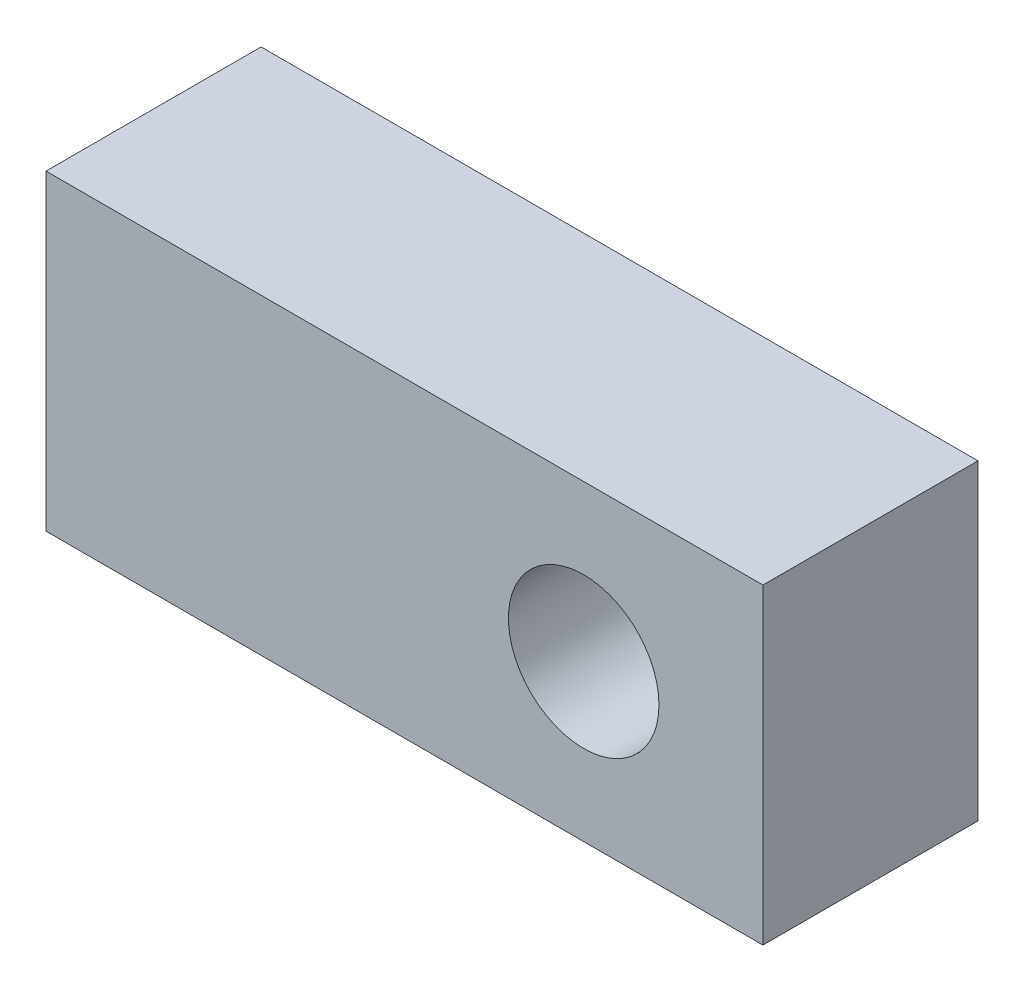
ISO-10303-21;
HEADER;
FILE_DESCRIPTION(('STEP AP214'),'2;1');
FILE_NAME('part.step','',(''),(''),'','','');
FILE_SCHEMA(('AUTOMOTIVE_DESIGN { 1 0 10303 214 1 1 1 1 }'));
ENDSEC;
DATA;
#1=APPLICATION_CONTEXT('core data for automotive mechanical design processes');
#2=APPLICATION_PROTOCOL_DEFINITION('international standard','automotive_design',2000,#1);
#3=PRODUCT_CONTEXT('',#1,'mechanical');
#4=PRODUCT('Part','Part','',(#3));
#5=PRODUCT_RELATED_PRODUCT_CATEGORY('part','',(#4));
#6=PRODUCT_DEFINITION_FORMATION('','',#4);
#7=PRODUCT_DEFINITION_CONTEXT('part definition',#1,'design');
#8=PRODUCT_DEFINITION('design','',#6,#7);
#9=PRODUCT_DEFINITION_SHAPE('','',#8);
#10=(LENGTH_UNIT() NAMED_UNIT(*) SI_UNIT(.MILLI.,.METRE.));
#11=(NAMED_UNIT(*) PLANE_ANGLE_UNIT() SI_UNIT($,.RADIAN.));
#12=(NAMED_UNIT(*) SI_UNIT($,.STERADIAN.) SOLID_ANGLE_UNIT());
#13=UNCERTAINTY_MEASURE_WITH_UNIT(LENGTH_MEASURE(1.E-05),#10,'distance_accuracy_value','');
#14=(GEOMETRIC_REPRESENTATION_CONTEXT(3) GLOBAL_UNCERTAINTY_ASSIGNED_CONTEXT((#13)) GLOBAL_UNIT_ASSIGNED_CONTEXT((#10,
#11,#12)) REPRESENTATION_CONTEXT('',''));
#15=CARTESIAN_POINT('',(0.,0.,0.));
#16=DIRECTION('',(0.,0.,1.));
#17=DIRECTION('',(1.,0.,0.));
#18=AXIS2_PLACEMENT_3D('',#15,#16,#17);
#19=CARTESIAN_POINT('',(0.,0.,3.));
#20=DIRECTION('',(0.,0.,-1.));
#21=DIRECTION('',(-1.,0.,0.));
#22=AXIS2_PLACEMENT_3D('',#19,#20,#21);
#23=PLANE('',#22);
#24=DIRECTION('',(0.,1.,0.));
#25=VECTOR('',#24,1.);
#26=CARTESIAN_POINT('',(10.,-4.35,3.));
#27=LINE('',#26,#25);
#28=CARTESIAN_POINT('',(10.,-4.35,3.));
#29=VERTEX_POINT('',#28);
#30=CARTESIAN_POINT('',(10.,4.35,3.));
#31=VERTEX_POINT('',#30);
#32=EDGE_CURVE('E85',#29,#31,#27,.T.);
#33=ORIENTED_EDGE('',*,*,#32,.T.);
#34=DIRECTION('',(-1.,0.,0.));
#35=VECTOR('',#34,1.);
#36=CARTESIAN_POINT('',(-9.99999999999999,4.35,3.));
#37=LINE('',#36,#35);
#38=CARTESIAN_POINT('',(-9.99999999999999,4.35,3.));
#39=VERTEX_POINT('',#38);
#40=EDGE_CURVE('E80',#31,#39,#37,.T.);
#41=ORIENTED_EDGE('',*,*,#40,.T.);
#42=DIRECTION('',(0.,-1.,0.));
#43=VECTOR('',#42,1.);
#44=CARTESIAN_POINT('',(-9.99999999999999,-4.35,3.));
#45=LINE('',#44,#43);
#46=CARTESIAN_POINT('',(-9.99999999999999,-4.35,3.));
#47=VERTEX_POINT('',#46);
#48=EDGE_CURVE('E83',#39,#47,#45,.T.);
#49=ORIENTED_EDGE('',*,*,#48,.T.);
#50=DIRECTION('',(1.,0.,0.));
#51=VECTOR('',#50,1.);
#52=CARTESIAN_POINT('',(-9.99999999999999,-4.35,3.));
#53=LINE('',#52,#51);
#54=EDGE_CURVE('E50',#47,#29,#53,.T.);
#55=ORIENTED_EDGE('',*,*,#54,.T.);
#56=EDGE_LOOP('',(#33,#41,#49,#55));
#57=FACE_BOUND('',#56,.T.);
#58=CARTESIAN_POINT('',(5.00000000000001,0.,3.));
#59=DIRECTION('',(0.,0.,1.));
#60=DIRECTION('',(1.,0.,0.));
#61=AXIS2_PLACEMENT_3D('',#58,#59,#60);
#62=CIRCLE('',#61,2.1);
#63=CARTESIAN_POINT('',(7.10000000000001,0.,3.));
#64=VERTEX_POINT('',#63);
#65=EDGE_CURVE('E100',#64,#64,#62,.T.);
#66=ORIENTED_EDGE('',*,*,#65,.F.);
#67=EDGE_LOOP('',(#66));
#68=FACE_BOUND('',#67,.T.);
#69=ADVANCED_FACE('F33',(#57,#68),#23,.F.);
#70=CARTESIAN_POINT('',(0.,0.,-3.));
#71=DIRECTION('',(0.,0.,-1.));
#72=DIRECTION('',(-1.,0.,0.));
#73=AXIS2_PLACEMENT_3D('',#70,#71,#72);
#74=PLANE('',#73);
#75=DIRECTION('',(0.,1.,0.));
#76=VECTOR('',#75,1.);
#77=CARTESIAN_POINT('',(10.,-4.35,-3.));
#78=LINE('',#77,#76);
#79=CARTESIAN_POINT('',(10.,-4.35,-3.));
#80=VERTEX_POINT('',#79);
#81=CARTESIAN_POINT('',(10.,4.35,-3.));
#82=VERTEX_POINT('',#81);
#83=EDGE_CURVE('E97',#80,#82,#78,.T.);
#84=ORIENTED_EDGE('',*,*,#83,.F.);
#85=DIRECTION('',(1.,0.,0.));
#86=VECTOR('',#85,1.);
#87=CARTESIAN_POINT('',(-9.99999999999999,-4.35,-3.));
#88=LINE('',#87,#86);
#89=CARTESIAN_POINT('',(-9.99999999999999,-4.35,-3.));
#90=VERTEX_POINT('',#89);
#91=EDGE_CURVE('E73',#90,#80,#88,.T.);
#92=ORIENTED_EDGE('',*,*,#91,.F.);
#93=DIRECTION('',(0.,-1.,0.));
#94=VECTOR('',#93,1.);
#95=CARTESIAN_POINT('',(-9.99999999999999,-4.35,-3.));
#96=LINE('',#95,#94);
#97=CARTESIAN_POINT('',(-9.99999999999999,4.35,-3.));
#98=VERTEX_POINT('',#97);
#99=EDGE_CURVE('E67',#98,#90,#96,.T.);
#100=ORIENTED_EDGE('',*,*,#99,.F.);
#101=DIRECTION('',(-1.,0.,0.));
#102=VECTOR('',#101,1.);
#103=CARTESIAN_POINT('',(-9.99999999999999,4.35,-3.));
#104=LINE('',#103,#102);
#105=EDGE_CURVE('E89',#82,#98,#104,.T.);
#106=ORIENTED_EDGE('',*,*,#105,.F.);
#107=EDGE_LOOP('',(#84,#92,#100,#106));
#108=FACE_BOUND('',#107,.T.);
#109=CARTESIAN_POINT('',(5.00000000000001,0.,-3.));
#110=DIRECTION('',(0.,0.,1.));
#111=DIRECTION('',(1.,0.,0.));
#112=AXIS2_PLACEMENT_3D('',#109,#110,#111);
#113=CIRCLE('',#112,2.1);
#114=CARTESIAN_POINT('',(7.10000000000001,0.,-3.));
#115=VERTEX_POINT('',#114);
#116=EDGE_CURVE('E112',#115,#115,#113,.T.);
#117=ORIENTED_EDGE('',*,*,#116,.T.);
#118=EDGE_LOOP('',(#117));
#119=FACE_BOUND('',#118,.T.);
#120=ADVANCED_FACE('F108',(#108,#119),#74,.T.);
#121=CARTESIAN_POINT('',(10.,-4.35,3.));
#122=DIRECTION('',(-1.,0.,0.));
#123=DIRECTION('',(0.,0.,1.));
#124=AXIS2_PLACEMENT_3D('',#121,#122,#123);
#125=PLANE('',#124);
#126=ORIENTED_EDGE('',*,*,#83,.T.);
#127=DIRECTION('',(0.,0.,-1.));
#128=VECTOR('',#127,1.);
#129=CARTESIAN_POINT('',(10.,4.35,3.));
#130=LINE('',#129,#128);
#131=EDGE_CURVE('E11',#31,#82,#130,.T.);
#132=ORIENTED_EDGE('',*,*,#131,.F.);
#133=ORIENTED_EDGE('',*,*,#32,.F.);
#134=DIRECTION('',(0.,0.,-1.));
#135=VECTOR('',#134,1.);
#136=CARTESIAN_POINT('',(10.,-4.35,3.));
#137=LINE('',#136,#135);
#138=EDGE_CURVE('E93',#29,#80,#137,.T.);
#139=ORIENTED_EDGE('',*,*,#138,.T.);
#140=EDGE_LOOP('',(#126,#132,#133,#139));
#141=FACE_BOUND('',#140,.T.);
#142=ADVANCED_FACE('F35',(#141),#125,.F.);
#143=CARTESIAN_POINT('',(-9.99999999999999,4.35,3.));
#144=DIRECTION('',(0.,-1.,0.));
#145=DIRECTION('',(0.,0.,-1.));
#146=AXIS2_PLACEMENT_3D('',#143,#144,#145);
#147=PLANE('',#146);
#148=ORIENTED_EDGE('',*,*,#105,.T.);
#149=DIRECTION('',(0.,0.,-1.));
#150=VECTOR('',#149,1.);
#151=CARTESIAN_POINT('',(-9.99999999999999,4.35,3.));
#152=LINE('',#151,#150);
#153=EDGE_CURVE('E42',#39,#98,#152,.T.);
#154=ORIENTED_EDGE('',*,*,#153,.F.);
#155=ORIENTED_EDGE('',*,*,#40,.F.);
#156=ORIENTED_EDGE('',*,*,#131,.T.);
#157=EDGE_LOOP('',(#148,#154,#155,#156));
#158=FACE_BOUND('',#157,.T.);
#159=ADVANCED_FACE('F88',(#158),#147,.F.);
#160=CARTESIAN_POINT('',(-9.99999999999999,-4.35,3.));
#161=DIRECTION('',(1.,0.,0.));
#162=DIRECTION('',(0.,0.,-1.));
#163=AXIS2_PLACEMENT_3D('',#160,#161,#162);
#164=PLANE('',#163);
#165=ORIENTED_EDGE('',*,*,#99,.T.);
#166=DIRECTION('',(0.,0.,-1.));
#167=VECTOR('',#166,1.);
#168=CARTESIAN_POINT('',(-9.99999999999999,-4.35,3.));
#169=LINE('',#168,#167);
#170=EDGE_CURVE('E90',#47,#90,#169,.T.);
#171=ORIENTED_EDGE('',*,*,#170,.F.);
#172=ORIENTED_EDGE('',*,*,#48,.F.);
#173=ORIENTED_EDGE('',*,*,#153,.T.);
#174=EDGE_LOOP('',(#165,#171,#172,#173));
#175=FACE_BOUND('',#174,.T.);
#176=ADVANCED_FACE('F91',(#175),#164,.F.);
#177=CARTESIAN_POINT('',(-9.99999999999999,-4.35,3.));
#178=DIRECTION('',(0.,1.,0.));
#179=DIRECTION('',(0.,0.,1.));
#180=AXIS2_PLACEMENT_3D('',#177,#178,#179);
#181=PLANE('',#180);
#182=ORIENTED_EDGE('',*,*,#91,.T.);
#183=ORIENTED_EDGE('',*,*,#138,.F.);
#184=ORIENTED_EDGE('',*,*,#54,.F.);
#185=ORIENTED_EDGE('',*,*,#170,.T.);
#186=EDGE_LOOP('',(#182,#183,#184,#185));
#187=FACE_BOUND('',#186,.T.);
#188=ADVANCED_FACE('F105',(#187),#181,.F.);
#189=CARTESIAN_POINT('',(5.00000000000001,0.,3.));
#190=DIRECTION('',(0.,0.,-1.));
#191=DIRECTION('',(-1.,0.,0.));
#192=AXIS2_PLACEMENT_3D('',#189,#190,#191);
#193=CYLINDRICAL_SURFACE('',#192,2.1);
#194=ORIENTED_EDGE('',*,*,#65,.T.);
#195=EDGE_LOOP('',(#194));
#196=FACE_BOUND('',#195,.T.);
#197=ORIENTED_EDGE('',*,*,#116,.F.);
#198=EDGE_LOOP('',(#197));
#199=FACE_BOUND('',#198,.T.);
#200=ADVANCED_FACE('F118',(#196,#199),#193,.F.);
#201=CLOSED_SHELL('',(#69,#120,#142,#159,#176,#188,#200));
#202=MANIFOLD_SOLID_BREP('B2',#201);
#203=ADVANCED_BREP_SHAPE_REPRESENTATION('',(#18,#202),#14);
#204=SHAPE_DEFINITION_REPRESENTATION(#9,#203);
ENDSEC;
END-ISO-10303-21;
